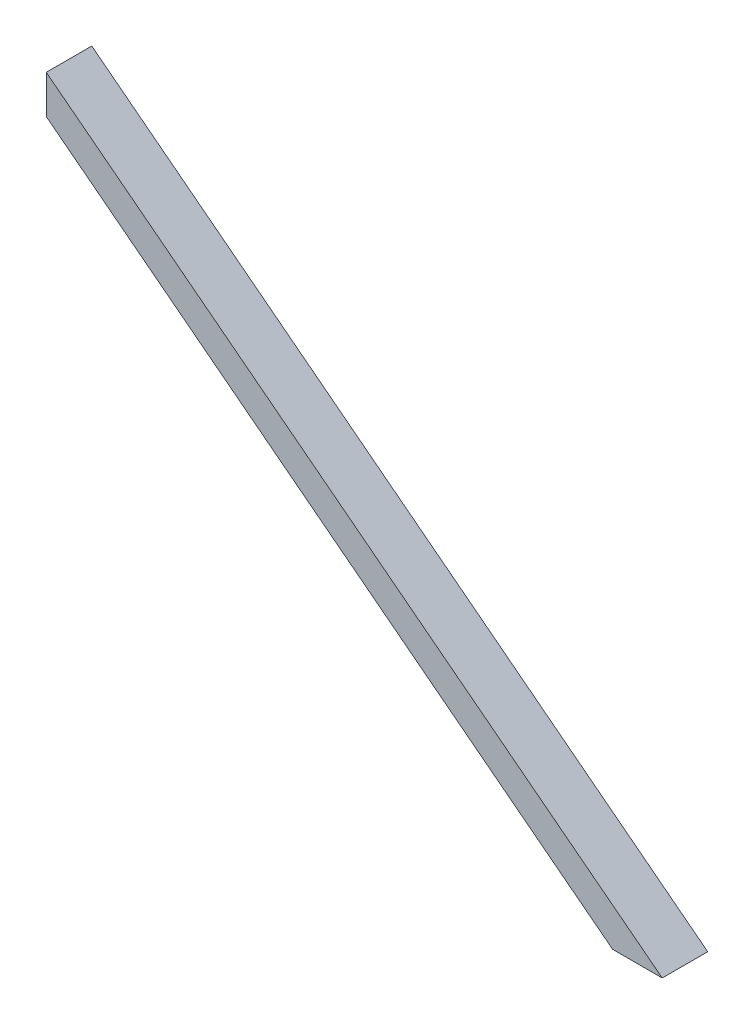
ISO-10303-21;
HEADER;
FILE_DESCRIPTION(('STEP AP214'),'2;1');
FILE_NAME('part.step','',(''),(''),'','','');
FILE_SCHEMA(('AUTOMOTIVE_DESIGN { 1 0 10303 214 1 1 1 1 }'));
ENDSEC;
DATA;
#1=APPLICATION_CONTEXT('core data for automotive mechanical design processes');
#2=APPLICATION_PROTOCOL_DEFINITION('international standard','automotive_design',2000,#1);
#3=PRODUCT_CONTEXT('',#1,'mechanical');
#4=PRODUCT('Part','Part','',(#3));
#5=PRODUCT_RELATED_PRODUCT_CATEGORY('part','',(#4));
#6=PRODUCT_DEFINITION_FORMATION('','',#4);
#7=PRODUCT_DEFINITION_CONTEXT('part definition',#1,'design');
#8=PRODUCT_DEFINITION('design','',#6,#7);
#9=PRODUCT_DEFINITION_SHAPE('','',#8);
#10=(LENGTH_UNIT() NAMED_UNIT(*) SI_UNIT(.MILLI.,.METRE.));
#11=(NAMED_UNIT(*) PLANE_ANGLE_UNIT() SI_UNIT($,.RADIAN.));
#12=(NAMED_UNIT(*) SI_UNIT($,.STERADIAN.) SOLID_ANGLE_UNIT());
#13=UNCERTAINTY_MEASURE_WITH_UNIT(LENGTH_MEASURE(1.E-05),#10,'distance_accuracy_value','');
#14=(GEOMETRIC_REPRESENTATION_CONTEXT(3) GLOBAL_UNCERTAINTY_ASSIGNED_CONTEXT((#13)) GLOBAL_UNIT_ASSIGNED_CONTEXT((#10,
#11,#12)) REPRESENTATION_CONTEXT('',''));
#15=CARTESIAN_POINT('',(0.,0.,0.));
#16=DIRECTION('',(0.,0.,1.));
#17=DIRECTION('',(1.,0.,0.));
#18=AXIS2_PLACEMENT_3D('',#15,#16,#17);
#19=CARTESIAN_POINT('',(15.539215877937,418.872107154275,-38.1));
#20=DIRECTION('',(0.611780152674682,0.791027840719493,0.));
#21=DIRECTION('',(-0.791027840719493,0.611780152674682,0.));
#22=AXIS2_PLACEMENT_3D('',#19,#20,#21);
#23=PLANE('',#22);
#24=DIRECTION('',(-0.791027840719493,0.611780152674682,0.));
#25=VECTOR('',#24,1.);
#26=CARTESIAN_POINT('',(15.539215877937,418.872107154275,0.));
#27=LINE('',#26,#25);
#28=CARTESIAN_POINT('',(531.159215877937,20.0921071542751,0.));
#29=VERTEX_POINT('',#28);
#30=CARTESIAN_POINT('',(15.539215877937,418.872107154275,0.));
#31=VERTEX_POINT('',#30);
#32=EDGE_CURVE('E90',#29,#31,#27,.T.);
#33=ORIENTED_EDGE('',*,*,#32,.F.);
#34=DIRECTION('',(0.,0.,1.));
#35=VECTOR('',#34,1.);
#36=CARTESIAN_POINT('',(531.159215877937,20.0921071542751,-38.1));
#37=LINE('',#36,#35);
#38=CARTESIAN_POINT('',(531.159215877937,20.0921071542751,-38.1));
#39=VERTEX_POINT('',#38);
#40=EDGE_CURVE('E37',#39,#29,#37,.T.);
#41=ORIENTED_EDGE('',*,*,#40,.F.);
#42=DIRECTION('',(-0.791027840719493,0.611780152674682,0.));
#43=VECTOR('',#42,1.);
#44=CARTESIAN_POINT('',(15.539215877937,418.872107154275,-38.1));
#45=LINE('',#44,#43);
#46=CARTESIAN_POINT('',(15.539215877937,418.872107154275,-38.1));
#47=VERTEX_POINT('',#46);
#48=EDGE_CURVE('E96',#39,#47,#45,.T.);
#49=ORIENTED_EDGE('',*,*,#48,.T.);
#50=DIRECTION('',(0.,0.,1.));
#51=VECTOR('',#50,1.);
#52=CARTESIAN_POINT('',(15.539215877937,418.872107154275,-38.1));
#53=LINE('',#52,#51);
#54=EDGE_CURVE('E11',#47,#31,#53,.T.);
#55=ORIENTED_EDGE('',*,*,#54,.T.);
#56=EDGE_LOOP('',(#33,#41,#49,#55));
#57=FACE_BOUND('',#56,.T.);
#58=ADVANCED_FACE('F33',(#57),#23,.T.);
#59=CARTESIAN_POINT('',(0.,398.78,-38.1));
#60=DIRECTION('',(-0.611780152674682,-0.791027840719493,0.));
#61=DIRECTION('',(0.791027840719493,-0.611780152674682,0.));
#62=AXIS2_PLACEMENT_3D('',#59,#60,#61);
#63=PLANE('',#62);
#64=DIRECTION('',(0.,0.,1.));
#65=VECTOR('',#64,1.);
#66=CARTESIAN_POINT('',(489.641033424727,20.0921071542751,-127.));
#67=LINE('',#66,#65);
#68=CARTESIAN_POINT('',(489.641033424727,20.0921071542751,-38.1));
#69=VERTEX_POINT('',#68);
#70=CARTESIAN_POINT('',(489.641033424727,20.0921071542751,0.));
#71=VERTEX_POINT('',#70);
#72=EDGE_CURVE('E73',#69,#71,#67,.T.);
#73=ORIENTED_EDGE('',*,*,#72,.T.);
#74=DIRECTION('',(0.791027840719493,-0.611780152674682,0.));
#75=VECTOR('',#74,1.);
#76=CARTESIAN_POINT('',(0.,398.78,0.));
#77=LINE('',#76,#75);
#78=CARTESIAN_POINT('',(15.5392158779369,386.761985749576,0.));
#79=VERTEX_POINT('',#78);
#80=EDGE_CURVE('E83',#79,#71,#77,.T.);
#81=ORIENTED_EDGE('',*,*,#80,.F.);
#82=DIRECTION('',(0.,0.,1.));
#83=VECTOR('',#82,1.);
#84=CARTESIAN_POINT('',(15.539215877937,386.761985749576,-127.));
#85=LINE('',#84,#83);
#86=CARTESIAN_POINT('',(15.539215877937,386.761985749576,-38.1));
#87=VERTEX_POINT('',#86);
#88=EDGE_CURVE('E48',#87,#79,#85,.T.);
#89=ORIENTED_EDGE('',*,*,#88,.F.);
#90=DIRECTION('',(0.791027840719493,-0.611780152674682,0.));
#91=VECTOR('',#90,1.);
#92=CARTESIAN_POINT('',(0.,398.78,-38.1));
#93=LINE('',#92,#91);
#94=EDGE_CURVE('E85',#87,#69,#93,.T.);
#95=ORIENTED_EDGE('',*,*,#94,.T.);
#96=EDGE_LOOP('',(#73,#81,#89,#95));
#97=FACE_BOUND('',#96,.T.);
#98=ADVANCED_FACE('F35',(#97),#63,.T.);
#99=CARTESIAN_POINT('',(0.,0.,-38.1));
#100=DIRECTION('',(0.,0.,-1.));
#101=DIRECTION('',(-1.,0.,0.));
#102=AXIS2_PLACEMENT_3D('',#99,#100,#101);
#103=PLANE('',#102);
#104=DIRECTION('',(1.,0.,0.));
#105=VECTOR('',#104,1.);
#106=CARTESIAN_POINT('',(0.,20.0921071542751,-38.1));
#107=LINE('',#106,#105);
#108=EDGE_CURVE('E86',#69,#39,#107,.T.);
#109=ORIENTED_EDGE('',*,*,#108,.F.);
#110=ORIENTED_EDGE('',*,*,#94,.F.);
#111=DIRECTION('',(0.,-1.,0.));
#112=VECTOR('',#111,1.);
#113=CARTESIAN_POINT('',(15.539215877937,0.,-38.1));
#114=LINE('',#113,#112);
#115=EDGE_CURVE('E91',#47,#87,#114,.T.);
#116=ORIENTED_EDGE('',*,*,#115,.F.);
#117=ORIENTED_EDGE('',*,*,#48,.F.);
#118=EDGE_LOOP('',(#109,#110,#116,#117));
#119=FACE_BOUND('',#118,.T.);
#120=ADVANCED_FACE('F106',(#119),#103,.T.);
#121=CARTESIAN_POINT('',(0.,0.,0.));
#122=DIRECTION('',(0.,0.,-1.));
#123=DIRECTION('',(-1.,0.,0.));
#124=AXIS2_PLACEMENT_3D('',#121,#122,#123);
#125=PLANE('',#124);
#126=ORIENTED_EDGE('',*,*,#80,.T.);
#127=DIRECTION('',(-1.,0.,0.));
#128=VECTOR('',#127,1.);
#129=CARTESIAN_POINT('',(531.159215877937,20.0921071542751,0.));
#130=LINE('',#129,#128);
#131=EDGE_CURVE('E70',#29,#71,#130,.T.);
#132=ORIENTED_EDGE('',*,*,#131,.F.);
#133=ORIENTED_EDGE('',*,*,#32,.T.);
#134=DIRECTION('',(0.,1.,0.));
#135=VECTOR('',#134,1.);
#136=CARTESIAN_POINT('',(15.539215877937,418.872107154275,0.));
#137=LINE('',#136,#135);
#138=EDGE_CURVE('E89',#79,#31,#137,.T.);
#139=ORIENTED_EDGE('',*,*,#138,.F.);
#140=EDGE_LOOP('',(#126,#132,#133,#139));
#141=FACE_BOUND('',#140,.T.);
#142=ADVANCED_FACE('F88',(#141),#125,.F.);
#143=CARTESIAN_POINT('',(15.539215877937,418.872107154275,-127.));
#144=DIRECTION('',(1.,0.,0.));
#145=DIRECTION('',(0.,0.,-1.));
#146=AXIS2_PLACEMENT_3D('',#143,#144,#145);
#147=PLANE('',#146);
#148=ORIENTED_EDGE('',*,*,#115,.T.);
#149=ORIENTED_EDGE('',*,*,#88,.T.);
#150=ORIENTED_EDGE('',*,*,#138,.T.);
#151=ORIENTED_EDGE('',*,*,#54,.F.);
#152=EDGE_LOOP('',(#148,#149,#150,#151));
#153=FACE_BOUND('',#152,.T.);
#154=ADVANCED_FACE('F107',(#153),#147,.F.);
#155=CARTESIAN_POINT('',(531.159215877937,20.0921071542751,-127.));
#156=DIRECTION('',(0.,1.,0.));
#157=DIRECTION('',(-1.,0.,0.));
#158=AXIS2_PLACEMENT_3D('',#155,#156,#157);
#159=PLANE('',#158);
#160=ORIENTED_EDGE('',*,*,#108,.T.);
#161=ORIENTED_EDGE('',*,*,#40,.T.);
#162=ORIENTED_EDGE('',*,*,#131,.T.);
#163=ORIENTED_EDGE('',*,*,#72,.F.);
#164=EDGE_LOOP('',(#160,#161,#162,#163));
#165=FACE_BOUND('',#164,.T.);
#166=ADVANCED_FACE('F72',(#165),#159,.F.);
#167=CLOSED_SHELL('',(#58,#98,#120,#142,#154,#166));
#168=MANIFOLD_SOLID_BREP('B2',#167);
#169=ADVANCED_BREP_SHAPE_REPRESENTATION('',(#18,#168),#14);
#170=SHAPE_DEFINITION_REPRESENTATION(#9,#169);
ENDSEC;
END-ISO-10303-21;
